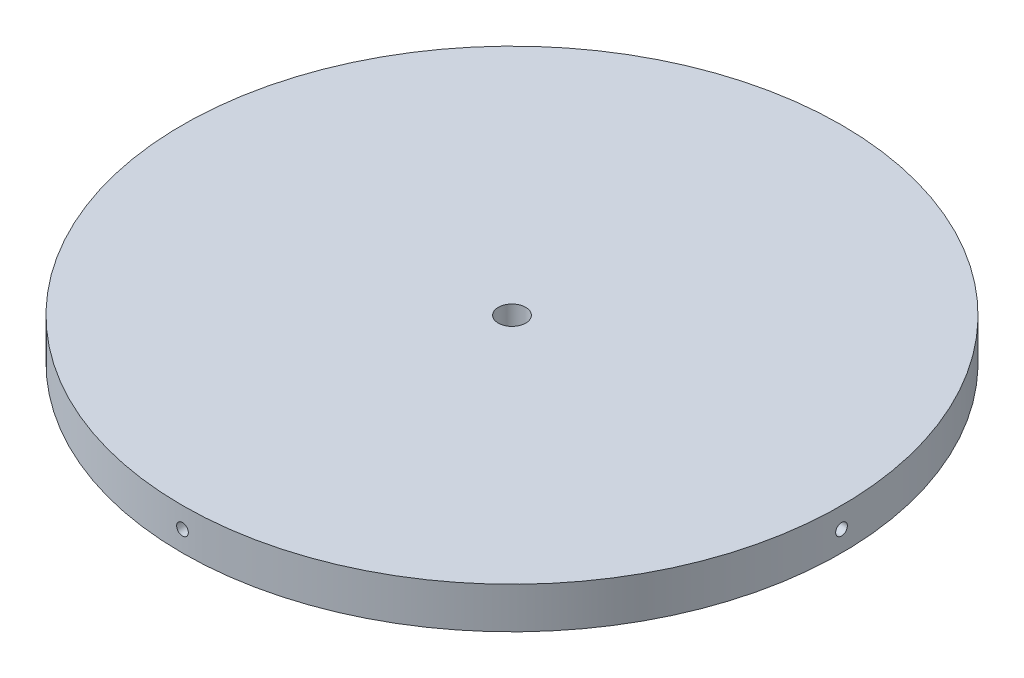
ISO-10303-21;
HEADER;
FILE_DESCRIPTION(('STEP AP214'),'2;1');
FILE_NAME('part.step','',(''),(''),'','','');
FILE_SCHEMA(('AUTOMOTIVE_DESIGN { 1 0 10303 214 1 1 1 1 }'));
ENDSEC;
DATA;
#1=APPLICATION_CONTEXT('core data for automotive mechanical design processes');
#2=APPLICATION_PROTOCOL_DEFINITION('international standard','automotive_design',2000,#1);
#3=PRODUCT_CONTEXT('',#1,'mechanical');
#4=PRODUCT('Part','Part','',(#3));
#5=PRODUCT_RELATED_PRODUCT_CATEGORY('part','',(#4));
#6=PRODUCT_DEFINITION_FORMATION('','',#4);
#7=PRODUCT_DEFINITION_CONTEXT('part definition',#1,'design');
#8=PRODUCT_DEFINITION('design','',#6,#7);
#9=PRODUCT_DEFINITION_SHAPE('','',#8);
#10=(LENGTH_UNIT() NAMED_UNIT(*) SI_UNIT(.MILLI.,.METRE.));
#11=(NAMED_UNIT(*) PLANE_ANGLE_UNIT() SI_UNIT($,.RADIAN.));
#12=(NAMED_UNIT(*) SI_UNIT($,.STERADIAN.) SOLID_ANGLE_UNIT());
#13=UNCERTAINTY_MEASURE_WITH_UNIT(LENGTH_MEASURE(1.E-05),#10,'distance_accuracy_value','');
#14=(GEOMETRIC_REPRESENTATION_CONTEXT(3) GLOBAL_UNCERTAINTY_ASSIGNED_CONTEXT((#13)) GLOBAL_UNIT_ASSIGNED_CONTEXT((#10,
#11,#12)) REPRESENTATION_CONTEXT('',''));
#15=CARTESIAN_POINT('',(0.,0.,0.));
#16=DIRECTION('',(0.,0.,1.));
#17=DIRECTION('',(1.,0.,0.));
#18=AXIS2_PLACEMENT_3D('',#15,#16,#17);
#19=CARTESIAN_POINT('',(0.,9.525,0.));
#20=DIRECTION('',(0.,-1.,0.));
#21=DIRECTION('',(0.,0.,-1.));
#22=AXIS2_PLACEMENT_3D('',#19,#20,#21);
#23=CYLINDRICAL_SURFACE('',#22,76.1746);
#24=CARTESIAN_POINT('',(-76.1625911695335,4.7625,1.35255000000079));
#25=CARTESIAN_POINT('',(-76.1625913318178,4.68653309786871,1.35254663318594));
#26=CARTESIAN_POINT('',(-76.1627060477417,4.61051126497765,1.34612842213873));
#27=CARTESIAN_POINT('',(-76.1631526381052,4.46056172084743,1.3206142161901));
#28=CARTESIAN_POINT('',(-76.1634847732258,4.3866366347137,1.30150300224006));
#29=CARTESIAN_POINT('',(-76.1643285653673,4.24307464772097,1.25114740979543));
#30=CARTESIAN_POINT('',(-76.1648401359019,4.17343569996043,1.21990887577359));
#31=CARTESIAN_POINT('',(-76.1659850439857,4.04041009425597,1.14619354351088));
#32=CARTESIAN_POINT('',(-76.1666183514398,3.9770218968928,1.10371952185477));
#33=CARTESIAN_POINT('',(-76.1679355660639,3.85826137607147,1.00872536322316));
#34=CARTESIAN_POINT('',(-76.1686194834858,3.80289068345009,0.956203187386675));
#35=CARTESIAN_POINT('',(-76.1699607411956,3.70175037900739,0.84260635603765));
#36=CARTESIAN_POINT('',(-76.1706180804338,3.65598114608205,0.781531363169549));
#37=CARTESIAN_POINT('',(-76.1718320812533,3.57534349835677,0.652560465586628));
#38=CARTESIAN_POINT('',(-76.1723887380619,3.54047560024732,0.584664237767256));
#39=CARTESIAN_POINT('',(-76.1733385746897,3.48263395049007,0.443980593985543));
#40=CARTESIAN_POINT('',(-76.1737317549518,3.45966016660453,0.371193191280818));
#41=CARTESIAN_POINT('',(-76.1743102772881,3.42626112549406,0.222801407657146));
#42=CARTESIAN_POINT('',(-76.1744956411789,3.41583455104581,0.147197323296592));
#43=CARTESIAN_POINT('',(-76.1746377065854,3.40782186013706,-0.00468828794464257));
#44=CARTESIAN_POINT('',(-76.1745944086883,3.41023571069592,-0.0809698130848129));
#45=CARTESIAN_POINT('',(-76.1742840512528,3.42783418744218,-0.232035998008856));
#46=CARTESIAN_POINT('',(-76.1740170168757,3.44301737759825,-0.30682082514221));
#47=CARTESIAN_POINT('',(-76.1732893175446,3.4857213252721,-0.452779916711149));
#48=CARTESIAN_POINT('',(-76.1728286523085,3.5132421007662,-0.523954175885833));
#49=CARTESIAN_POINT('',(-76.1717655783832,3.5798416417419,-0.660676284030646));
#50=CARTESIAN_POINT('',(-76.1711631616189,3.61892106571735,-0.726223812172487));
#51=CARTESIAN_POINT('',(-76.1698844932242,3.70752806105337,-0.849828238940553));
#52=CARTESIAN_POINT('',(-76.169208241554,3.75705563803346,-0.907885133537938));
#53=CARTESIAN_POINT('',(-76.1678580243648,3.86516117015754,-1.01486865597108));
#54=CARTESIAN_POINT('',(-76.1671840591745,3.92374037464282,-1.06379402137592));
#55=CARTESIAN_POINT('',(-76.165914493049,4.04828187743854,-1.1511159371692));
#56=CARTESIAN_POINT('',(-76.1653188921247,4.11424417678791,-1.18951248607604));
#57=CARTESIAN_POINT('',(-76.1642732138611,4.25168009404666,-1.25468665966714));
#58=CARTESIAN_POINT('',(-76.1638231370003,4.32315373007827,-1.28146424614435));
#59=CARTESIAN_POINT('',(-76.1631192730441,4.46958309676921,-1.32263956423576));
#60=CARTESIAN_POINT('',(-76.1628654857557,4.54453882400502,-1.33703730802132));
#61=CARTESIAN_POINT('',(-76.1625828484964,4.69579364816456,-1.35304269240563));
#62=CARTESIAN_POINT('',(-76.1625539678065,4.77209256020158,-1.35465207971175));
#63=CARTESIAN_POINT('',(-76.1627243198163,4.92387750401343,-1.34503961511816));
#64=CARTESIAN_POINT('',(-76.1629235524302,4.99936353609414,-1.33381776804693));
#65=CARTESIAN_POINT('',(-76.163527642029,5.14737504847621,-1.29886283211518));
#66=CARTESIAN_POINT('',(-76.1639324860076,5.21990071572595,-1.27513053461639));
#67=CARTESIAN_POINT('',(-76.1649021458778,5.3599384524946,-1.21582918789614));
#68=CARTESIAN_POINT('',(-76.1654669618686,5.42745051889775,-1.18026013131863));
#69=CARTESIAN_POINT('',(-76.1666929646331,5.55555265144326,-1.09829045300828));
#70=CARTESIAN_POINT('',(-76.1673541618726,5.61614196457616,-1.05188865463172));
#71=CARTESIAN_POINT('',(-76.1686983478926,5.72867110910763,-0.949572408402749));
#72=CARTESIAN_POINT('',(-76.1693813366983,5.78061093050641,-0.893657949552762));
#73=CARTESIAN_POINT('',(-76.1706921961768,5.87437249039245,-0.773896138553624));
#74=CARTESIAN_POINT('',(-76.1713200607014,5.9161931011722,-0.710047903445597));
#75=CARTESIAN_POINT('',(-76.172449800465,5.98852135229293,-0.576235552859802));
#76=CARTESIAN_POINT('',(-76.1729516758898,6.01902900933406,-0.506271446410454));
#77=CARTESIAN_POINT('',(-76.1737728288505,6.06786339526051,-0.362217653866183));
#78=CARTESIAN_POINT('',(-76.1740921174107,6.08619085957265,-0.288128217147021));
#79=CARTESIAN_POINT('',(-76.1745121451594,6.11014703050433,-0.137923290346605));
#80=CARTESIAN_POINT('',(-76.1746128841591,6.11577572614824,-0.0618077985142768));
#81=CARTESIAN_POINT('',(-76.1745844558271,6.11417445973102,0.0902771157054055));
#82=CARTESIAN_POINT('',(-76.1744553205151,6.10694628852903,0.166246556960894));
#83=CARTESIAN_POINT('',(-76.1739817621638,6.07984012377235,0.315893573384177));
#84=CARTESIAN_POINT('',(-76.1736373386937,6.05996210489637,0.389571143964009));
#85=CARTESIAN_POINT('',(-76.172772016909,6.00812045662003,0.532544410246637));
#86=CARTESIAN_POINT('',(-76.1722511153782,5.97615660696814,0.601840026066066));
#87=CARTESIAN_POINT('',(-76.171091570252,5.90105214198545,0.734079137418544));
#88=CARTESIAN_POINT('',(-76.1704529311519,5.85791195335362,0.797022875331085));
#89=CARTESIAN_POINT('',(-76.1691298427897,5.76167753104772,0.914777610084021));
#90=CARTESIAN_POINT('',(-76.1684453920218,5.70858297009328,0.969588339420757));
#91=CARTESIAN_POINT('',(-76.1671076722016,5.59393010957159,1.06953236851041));
#92=CARTESIAN_POINT('',(-76.1664544109313,5.53236971241236,1.11466326276146));
#93=CARTESIAN_POINT('',(-76.1652525839246,5.40251728126712,1.193969380067));
#94=CARTESIAN_POINT('',(-76.1647040746045,5.33422164974635,1.22813870625481));
#95=CARTESIAN_POINT('',(-76.1637747249306,5.19291543897584,1.28448687045357));
#96=CARTESIAN_POINT('',(-76.1633936840465,5.11991061945161,1.30668005624902));
#97=CARTESIAN_POINT('',(-76.162944445983,4.99911830304652,1.33254273142713));
#98=CARTESIAN_POINT('',(-76.1628125397191,4.95211539888689,1.34003606670425));
#99=CARTESIAN_POINT('',(-76.1626358507074,4.85758217076169,1.35004075447477));
#100=CARTESIAN_POINT('',(-76.1625910679508,4.81005184684975,1.35255210747469));
#101=CARTESIAN_POINT('',(-76.1625911695335,4.7625,1.35255000000079));
#102=B_SPLINE_CURVE_WITH_KNOTS('',3,(#24,#25,#26,#27,#28,#29,#30,#31,#32,#33,#34,#35,#36,#37,
#38,#39,#40,#41,#42,#43,#44,#45,#46,#47,#48,#49,#50,#51,#52,#53,#54,#55,#56,#57,#58,#59,#60,#61,
#62,#63,#64,#65,#66,#67,#68,#69,#70,#71,#72,#73,#74,#75,#76,#77,#78,#79,#80,#81,#82,#83,#84,#85,
#86,#87,#88,#89,#90,#91,#92,#93,#94,#95,#96,#97,#98,#99,#100,#101),.UNSPECIFIED.,.T.,.F.,(4,2,2,
2,2,2,2,2,2,2,2,2,2,2,2,2,2,2,2,2,2,2,2,2,2,2,2,2,2,2,2,2,2,2,2,2,2,2,4),(0.,0.227727140072635,
0.455727821586148,0.683618759737946,0.911453432568021,1.1393343842314,1.36722432691727,
1.59512506926415,1.823025193907,2.05090139119322,2.27877700317945,2.50662699185412,
2.73447731251577,2.96234061626461,3.19020404256931,3.41809894762149,3.64599388474286,
3.8738895712536,4.10178503370631,4.3296493683493,4.55751361724546,4.78536345407753,
5.01321343250887,5.24108817134626,5.46896317363123,5.69686355913317,5.9247636082078,
6.15264989567459,6.38053638010493,6.60839112424907,6.83624632449302,7.06410567735778,
7.29195633211224,7.51981447946663,7.7477291856114,7.97576629555885,8.20352960007281,
8.34607651044311,8.48862340632087),.UNSPECIFIED.);
#103=CARTESIAN_POINT('',(-76.1625911695335,4.7625,1.35255000000079));
#104=VERTEX_POINT('',#103);
#105=EDGE_CURVE('E11',#104,#104,#102,.T.);
#106=ORIENTED_EDGE('',*,*,#105,.T.);
#107=EDGE_LOOP('',(#106));
#108=FACE_BOUND('',#107,.T.);
#109=CARTESIAN_POINT('',(0.,6.11504999999999,-76.1746));
#110=CARTESIAN_POINT('',(-0.0759669031959398,6.11504663318611,-76.1745998378203));
#111=CARTESIAN_POINT('',(-0.151988737147994,6.10862842196507,-76.1744851405251));
#112=CARTESIAN_POINT('',(-0.301938283482509,6.0831142152633,-76.1740386164844));
#113=CARTESIAN_POINT('',(-0.375863370760367,6.06400300073754,-76.1737065290927));
#114=CARTESIAN_POINT('',(-0.519425360171584,6.01364740660829,-76.1728628406467));
#115=CARTESIAN_POINT('',(-0.589064309196794,5.98240887145006,-76.1723513260741));
#116=CARTESIAN_POINT('',(-0.722089917016071,5.90869353651212,-76.1712065135406));
#117=CARTESIAN_POINT('',(-0.785478115230995,5.86621951332,-76.1705732456787));
#118=CARTESIAN_POINT('',(-0.904238635073783,5.77122535314371,-76.1692560766181));
#119=CARTESIAN_POINT('',(-0.959609326138674,5.71870317764102,-76.1685721651624));
#120=CARTESIAN_POINT('',(-1.06074962758195,5.60510634761105,-76.1672308830571));
#121=CARTESIAN_POINT('',(-1.1065188590596,5.544031355724,-76.1665735134558));
#122=CARTESIAN_POINT('',(-1.18715650528408,5.41506045898393,-76.1653594289303));
#123=CARTESIAN_POINT('',(-1.22202440307092,5.34716423085783,-76.1648027187802));
#124=CARTESIAN_POINT('',(-1.27986605214682,5.20648058640919,-76.1638527758335));
#125=CARTESIAN_POINT('',(-1.30283983567756,5.13369318334589,-76.1634595425938));
#126=CARTESIAN_POINT('',(-1.33623887602735,4.98530139869178,-76.1628809379442));
#127=CARTESIAN_POINT('',(-1.34666545004531,4.90969731365389,-76.1626955447155));
#128=CARTESIAN_POINT('',(-1.35467813985884,4.75781170109146,-76.1625534570781));
#129=CARTESIAN_POINT('',(-1.35226428863958,4.68153017530768,-76.1625967620819));
#130=CARTESIAN_POINT('',(-1.33466581086186,4.53046399333399,-76.1629071671051));
#131=CARTESIAN_POINT('',(-1.31948262099914,4.45567916971715,-76.1631742419478));
#132=CARTESIAN_POINT('',(-1.27677867513642,4.30972008503016,-76.1639020377809));
#133=CARTESIAN_POINT('',(-1.24925790115358,4.23854582922281,-76.1643627590535));
#134=CARTESIAN_POINT('',(-1.18265836327778,4.10182372510504,-76.1654259361396));
#135=CARTESIAN_POINT('',(-1.14357894053353,4.03627619779705,-76.166028400032));
#136=CARTESIAN_POINT('',(-1.05497194780953,3.91267177217164,-76.1673071330586));
#137=CARTESIAN_POINT('',(-1.00544437221108,3.85461487788248,-76.1679834022326));
#138=CARTESIAN_POINT('',(-0.897338841049925,3.74763135383609,-76.1693336172077));
#139=CARTESIAN_POINT('',(-0.838759635868295,3.69870598679023,-76.1700075626749));
#140=CARTESIAN_POINT('',(-0.714218131100806,3.61138406802023,-76.1712770606937));
#141=CARTESIAN_POINT('',(-0.648255830478291,3.57298751777443,-76.1718726132344));
#142=CARTESIAN_POINT('',(-0.510819912911578,3.50781334322623,-76.1729181873081));
#143=CARTESIAN_POINT('',(-0.439346278044282,3.48103575671107,-76.1733682083677));
#144=CARTESIAN_POINT('',(-0.292916913878398,3.43986043818532,-76.1740719777359));
#145=CARTESIAN_POINT('',(-0.217961188001414,3.42546269401023,-76.1743257262373));
#146=CARTESIAN_POINT('',(-0.0667063644147724,3.40945730816293,-76.1746083200011));
#147=CARTESIAN_POINT('',(0.00959254844751346,3.40784792015508,-76.1746371959715));
#148=CARTESIAN_POINT('',(0.161377494079737,3.41746038363994,-76.1744668705921));
#149=CARTESIAN_POINT('',(0.236863527155562,3.42868223030407,-76.1742676693282));
#150=CARTESIAN_POINT('',(0.384875044189094,3.46363716640883,-76.173663664801));
#151=CARTESIAN_POINT('',(0.457400714997972,3.48736946489914,-76.1732588745357));
#152=CARTESIAN_POINT('',(0.597438458444466,3.54667081479803,-76.1722893208728));
#153=CARTESIAN_POINT('',(0.664950527968757,3.58223987355686,-76.1717245573758));
#154=CARTESIAN_POINT('',(0.793052662549558,3.66420955502574,-76.1704986354668));
#155=CARTESIAN_POINT('',(0.853641974951883,3.71061135382428,-76.1698374665911));
#156=CARTESIAN_POINT('',(0.966171117811906,3.812927600488,-76.1684933006567));
#157=CARTESIAN_POINT('',(1.0181109382667,3.86884205935417,-76.1678103035729));
#158=CARTESIAN_POINT('',(1.11187249624285,3.98860386992294,-76.1664993945718));
#159=CARTESIAN_POINT('',(1.15369310605572,4.05245210458512,-76.1658714887992));
#160=CARTESIAN_POINT('',(1.22602135547702,4.18626445403353,-76.1647416515947));
#161=CARTESIAN_POINT('',(1.25652901178564,4.25622855979132,-76.1642397199769));
#162=CARTESIAN_POINT('',(1.30536339719808,4.40028235287769,-76.1634184643603));
#163=CARTESIAN_POINT('',(1.32369086141227,4.47437179093779,-76.1630991293414));
#164=CARTESIAN_POINT('',(1.34764703169322,4.6245767205557,-76.1626790387343));
#165=CARTESIAN_POINT('',(1.35327572679142,4.70069221386346,-76.1625782833351));
#166=CARTESIAN_POINT('',(1.35167445883825,4.85277712704119,-76.1626067161695));
#167=CARTESIAN_POINT('',(1.34444628729294,4.92874656578615,-76.1627358723668));
#168=CARTESIAN_POINT('',(1.31734012273543,5.07839357710609,-76.1632095005568));
#169=CARTESIAN_POINT('',(1.29746210439744,5.15207114509229,-76.1635539729806));
#170=CARTESIAN_POINT('',(1.24562045811338,5.29504440637428,-76.1644193993455));
#171=CARTESIAN_POINT('',(1.21365660991066,5.36434001978482,-76.164940356503));
#172=CARTESIAN_POINT('',(1.1385521485672,5.49657912692842,-76.1660999951169));
#173=CARTESIAN_POINT('',(1.09541196212285,5.55952286303949,-76.1667386720787));
#174=CARTESIAN_POINT('',(0.999177542161064,5.67727759804536,-76.168061801904));
#175=CARTESIAN_POINT('',(0.946082980867527,5.73208832903134,-76.1687462562743));
#176=CARTESIAN_POINT('',(0.831430118997713,5.83203236128946,-76.1700839473755));
#177=CARTESIAN_POINT('',(0.769869720832981,5.87716325706396,-76.1707371763155));
#178=CARTESIAN_POINT('',(0.640017288932585,5.95646937593903,-76.1719389169514));
#179=CARTESIAN_POINT('',(0.571721657840508,5.99063870246546,-76.1724873722223));
#180=CARTESIAN_POINT('',(0.430415447990483,6.04698686741764,-76.1734166157479));
#181=CARTESIAN_POINT('',(0.357410628955742,6.06918005362238,-76.1737976045306));
#182=CARTESIAN_POINT('',(0.236618311449319,6.09504272999781,-76.174246777958));
#183=CARTESIAN_POINT('',(0.189615405614296,6.10253606581219,-76.1743786641761));
#184=CARTESIAN_POINT('',(0.0950821741295524,6.11254075429683,-76.1745553259513));
#185=CARTESIAN_POINT('',(0.0475518485334259,6.11505210747334,-76.1746001015172));
#186=CARTESIAN_POINT('',(0.,6.11504999999999,-76.1746));
#187=B_SPLINE_CURVE_WITH_KNOTS('',3,(#109,#110,#111,#112,#113,#114,#115,#116,#117,#118,#119,
#120,#121,#122,#123,#124,#125,#126,#127,#128,#129,#130,#131,#132,#133,#134,#135,#136,#137,#138,
#139,#140,#141,#142,#143,#144,#145,#146,#147,#148,#149,#150,#151,#152,#153,#154,#155,#156,#157,
#158,#159,#160,#161,#162,#163,#164,#165,#166,#167,#168,#169,#170,#171,#172,#173,#174,#175,#176,
#177,#178,#179,#180,#181,#182,#183,#184,#185,#186),.UNSPECIFIED.,.T.,.F.,(4,2,2,2,2,2,2,2,2,2,2,
2,2,2,2,2,2,2,2,2,2,2,2,2,2,2,2,2,2,2,2,2,2,2,2,2,2,2,4),(0.,0.227727143269717,
0.455727827910921,0.683618769709577,0.911453446130337,1.13933439361215,1.36722433222943,
1.59512507614102,1.82302520227312,2.05090140149201,2.27877701533088,2.50662699400251,
2.73447730478141,2.96234060569549,3.19020402914776,3.41809893834134,3.6459938795335,
3.87388956188116,4.10178502029675,4.32964935752718,4.5575136090091,4.78536345592028,
5.01321344431952,5.24108818144064,5.4689631820908,5.6968635659797,5.92476361344074,
6.15264990521509,6.38053639382594,6.60839113068469,6.8362463237248,7.06410566948288,
7.29195631718295,7.51981446883156,7.74772917917171,7.97576628724141,8.20352958998387,
8.34607650539727,8.4886234063257),.UNSPECIFIED.);
#188=CARTESIAN_POINT('',(0.,6.11504999999999,-76.1746));
#189=VERTEX_POINT('',#188);
#190=EDGE_CURVE('E47',#189,#189,#187,.T.);
#191=ORIENTED_EDGE('',*,*,#190,.T.);
#192=EDGE_LOOP('',(#191));
#193=FACE_BOUND('',#192,.T.);
#194=CARTESIAN_POINT('',(76.1625911695335,4.7625,-1.35255000000025));
#195=CARTESIAN_POINT('',(76.1625913318179,4.68653309786871,-1.35254663318541));
#196=CARTESIAN_POINT('',(76.1627060477417,4.61051126497765,-1.3461284221382));
#197=CARTESIAN_POINT('',(76.1631526381052,4.46056172084743,-1.32061421618956));
#198=CARTESIAN_POINT('',(76.1634847732259,4.3866366347137,-1.30150300223953));
#199=CARTESIAN_POINT('',(76.1643285653673,4.24307464772097,-1.2511474097949));
#200=CARTESIAN_POINT('',(76.164840135902,4.17343569996043,-1.21990887577306));
#201=CARTESIAN_POINT('',(76.1659850439857,4.04041009425597,-1.14619354351035));
#202=CARTESIAN_POINT('',(76.1666183514398,3.9770218968928,-1.10371952185424));
#203=CARTESIAN_POINT('',(76.1679355660639,3.85826137607147,-1.00872536322262));
#204=CARTESIAN_POINT('',(76.1686194834858,3.80289068345009,-0.956203187386144));
#205=CARTESIAN_POINT('',(76.1699607411956,3.70175037900739,-0.842606356037118));
#206=CARTESIAN_POINT('',(76.1706180804338,3.65598114608205,-0.781531363169017));
#207=CARTESIAN_POINT('',(76.1718320812533,3.57534349835677,-0.652560465586096));
#208=CARTESIAN_POINT('',(76.1723887380619,3.54047560024732,-0.584664237766724));
#209=CARTESIAN_POINT('',(76.1733385746897,3.48263395049007,-0.443980593985011));
#210=CARTESIAN_POINT('',(76.1737317549518,3.45966016660453,-0.371193191280286));
#211=CARTESIAN_POINT('',(76.1743102772881,3.42626112549406,-0.222801407656614));
#212=CARTESIAN_POINT('',(76.1744956411789,3.41583455104581,-0.14719732329606));
#213=CARTESIAN_POINT('',(76.1746377065854,3.40782186013706,0.00468828794517483));
#214=CARTESIAN_POINT('',(76.1745944086883,3.41023571069592,0.0809698130853454));
#215=CARTESIAN_POINT('',(76.1742840512528,3.42783418744218,0.232035998009389));
#216=CARTESIAN_POINT('',(76.1740170168757,3.44301737759825,0.306820825142744));
#217=CARTESIAN_POINT('',(76.1732893175446,3.4857213252721,0.452779916711682));
#218=CARTESIAN_POINT('',(76.1728286523085,3.5132421007662,0.523954175886366));
#219=CARTESIAN_POINT('',(76.1717655783832,3.5798416417419,0.660676284031178));
#220=CARTESIAN_POINT('',(76.1711631616189,3.61892106571735,0.726223812173019));
#221=CARTESIAN_POINT('',(76.1698844932242,3.70752806105337,0.849828238941086));
#222=CARTESIAN_POINT('',(76.169208241554,3.75705563803346,0.90788513353847));
#223=CARTESIAN_POINT('',(76.1678580243648,3.86516117015754,1.01486865597161));
#224=CARTESIAN_POINT('',(76.1671840591745,3.92374037464282,1.06379402137645));
#225=CARTESIAN_POINT('',(76.1659144930489,4.04828187743854,1.15111593716974));
#226=CARTESIAN_POINT('',(76.1653188921247,4.11424417678791,1.18951248607658));
#227=CARTESIAN_POINT('',(76.1642732138611,4.25168009404666,1.25468665966767));
#228=CARTESIAN_POINT('',(76.1638231370003,4.32315373007827,1.28146424614488));
#229=CARTESIAN_POINT('',(76.1631192730441,4.46958309676921,1.32263956423629));
#230=CARTESIAN_POINT('',(76.1628654857557,4.54453882400502,1.33703730802185));
#231=CARTESIAN_POINT('',(76.1625828484964,4.69579364816457,1.35304269240616));
#232=CARTESIAN_POINT('',(76.1625539678065,4.77209256020158,1.35465207971228));
#233=CARTESIAN_POINT('',(76.1627243198163,4.92387750401343,1.34503961511869));
#234=CARTESIAN_POINT('',(76.1629235524302,4.99936353609414,1.33381776804746));
#235=CARTESIAN_POINT('',(76.163527642029,5.14737504847621,1.29886283211571));
#236=CARTESIAN_POINT('',(76.1639324860076,5.21990071572595,1.27513053461692));
#237=CARTESIAN_POINT('',(76.1649021458777,5.3599384524946,1.21582918789667));
#238=CARTESIAN_POINT('',(76.1654669618686,5.42745051889775,1.18026013131916));
#239=CARTESIAN_POINT('',(76.1666929646331,5.55555265144326,1.09829045300881));
#240=CARTESIAN_POINT('',(76.1673541618726,5.61614196457616,1.05188865463225));
#241=CARTESIAN_POINT('',(76.1686983478926,5.72867110910763,0.949572408403281));
#242=CARTESIAN_POINT('',(76.1693813366983,5.78061093050641,0.893657949553294));
#243=CARTESIAN_POINT('',(76.1706921961767,5.87437249039245,0.773896138554155));
#244=CARTESIAN_POINT('',(76.1713200607014,5.9161931011722,0.710047903446129));
#245=CARTESIAN_POINT('',(76.172449800465,5.98852135229293,0.576235552860333));
#246=CARTESIAN_POINT('',(76.1729516758898,6.01902900933406,0.506271446410986));
#247=CARTESIAN_POINT('',(76.1737728288505,6.06786339526051,0.362217653866714));
#248=CARTESIAN_POINT('',(76.1740921174107,6.08619085957265,0.288128217147552));
#249=CARTESIAN_POINT('',(76.1745121451594,6.11014703050433,0.137923290347137));
#250=CARTESIAN_POINT('',(76.1746128841591,6.11577572614824,0.061807798514808));
#251=CARTESIAN_POINT('',(76.1745844558271,6.11417445973102,-0.0902771157048748));
#252=CARTESIAN_POINT('',(76.1744553205151,6.10694628852903,-0.166246556960363));
#253=CARTESIAN_POINT('',(76.1739817621638,6.07984012377235,-0.315893573383646));
#254=CARTESIAN_POINT('',(76.1736373386937,6.05996210489637,-0.389571143963478));
#255=CARTESIAN_POINT('',(76.172772016909,6.00812045662003,-0.532544410246106));
#256=CARTESIAN_POINT('',(76.1722511153782,5.97615660696814,-0.601840026065535));
#257=CARTESIAN_POINT('',(76.171091570252,5.90105214198545,-0.734079137418013));
#258=CARTESIAN_POINT('',(76.1704529311519,5.85791195335362,-0.797022875330554));
#259=CARTESIAN_POINT('',(76.1691298427897,5.76167753104772,-0.91477761008349));
#260=CARTESIAN_POINT('',(76.1684453920219,5.70858297009328,-0.969588339420225));
#261=CARTESIAN_POINT('',(76.1671076722016,5.59393010957159,-1.06953236850988));
#262=CARTESIAN_POINT('',(76.1664544109313,5.53236971241236,-1.11466326276093));
#263=CARTESIAN_POINT('',(76.1652525839246,5.40251728126712,-1.19396938006647));
#264=CARTESIAN_POINT('',(76.1647040746045,5.33422164974635,-1.22813870625428));
#265=CARTESIAN_POINT('',(76.1637747249306,5.19291543897584,-1.28448687045303));
#266=CARTESIAN_POINT('',(76.1633936840466,5.1199106194516,-1.30668005624849));
#267=CARTESIAN_POINT('',(76.162944445983,4.99911830304651,-1.3325427314266));
#268=CARTESIAN_POINT('',(76.1628125397191,4.95211539888689,-1.34003606670372));
#269=CARTESIAN_POINT('',(76.1626358507074,4.85758217076169,-1.35004075447424));
#270=CARTESIAN_POINT('',(76.1625910679508,4.81005184684975,-1.35255210747416));
#271=CARTESIAN_POINT('',(76.1625911695335,4.7625,-1.35255000000025));
#272=B_SPLINE_CURVE_WITH_KNOTS('',3,(#194,#195,#196,#197,#198,#199,#200,#201,#202,#203,#204,
#205,#206,#207,#208,#209,#210,#211,#212,#213,#214,#215,#216,#217,#218,#219,#220,#221,#222,#223,
#224,#225,#226,#227,#228,#229,#230,#231,#232,#233,#234,#235,#236,#237,#238,#239,#240,#241,#242,
#243,#244,#245,#246,#247,#248,#249,#250,#251,#252,#253,#254,#255,#256,#257,#258,#259,#260,#261,
#262,#263,#264,#265,#266,#267,#268,#269,#270,#271),.UNSPECIFIED.,.T.,.F.,(4,2,2,2,2,2,2,2,2,2,2,
2,2,2,2,2,2,2,2,2,2,2,2,2,2,2,2,2,2,2,2,2,2,2,2,2,2,2,4),(0.,0.227727140072635,
0.455727821586148,0.683618759737944,0.91145343256802,1.1393343842314,1.36722432691727,
1.59512506926415,1.823025193907,2.05090139119322,2.27877700317946,2.50662699185412,
2.73447731251577,2.96234061626461,3.19020404256931,3.41809894762149,3.64599388474286,
3.8738895712536,4.10178503370631,4.3296493683493,4.55751361724546,4.78536345407753,
5.01321343250888,5.24108817134626,5.46896317363123,5.69686355913317,5.9247636082078,
6.15264989567459,6.38053638010493,6.60839112424907,6.83624632449302,7.06410567735778,
7.29195633211224,7.51981447946663,7.7477291856114,7.97576629555885,8.20352960007281,
8.34607651044311,8.48862340632087),.UNSPECIFIED.);
#273=CARTESIAN_POINT('',(76.1625911695335,4.7625,-1.35255000000025));
#274=VERTEX_POINT('',#273);
#275=EDGE_CURVE('E99',#274,#274,#272,.T.);
#276=ORIENTED_EDGE('',*,*,#275,.T.);
#277=EDGE_LOOP('',(#276));
#278=FACE_BOUND('',#277,.T.);
#279=CARTESIAN_POINT('',(1.35254999999999,4.7625,76.1625911695335));
#280=CARTESIAN_POINT('',(1.35254663318514,4.68653309786871,76.1625913318179));
#281=CARTESIAN_POINT('',(1.34612842213793,4.61051126497765,76.1627060477417));
#282=CARTESIAN_POINT('',(1.3206142161893,4.46056172084743,76.1631526381052));
#283=CARTESIAN_POINT('',(1.30150300223926,4.3866366347137,76.1634847732259));
#284=CARTESIAN_POINT('',(1.25114740979463,4.24307464772097,76.1643285653673));
#285=CARTESIAN_POINT('',(1.2199088757728,4.17343569996043,76.164840135902));
#286=CARTESIAN_POINT('',(1.14619354351008,4.04041009425597,76.1659850439857));
#287=CARTESIAN_POINT('',(1.10371952185397,3.9770218968928,76.1666183514398));
#288=CARTESIAN_POINT('',(1.00872536322236,3.85826137607147,76.1679355660639));
#289=CARTESIAN_POINT('',(0.956203187385877,3.80289068345009,76.1686194834858));
#290=CARTESIAN_POINT('',(0.842606356036852,3.70175037900739,76.1699607411956));
#291=CARTESIAN_POINT('',(0.781531363168751,3.65598114608205,76.1706180804338));
#292=CARTESIAN_POINT('',(0.65256046558583,3.57534349835677,76.1718320812533));
#293=CARTESIAN_POINT('',(0.584664237766458,3.54047560024732,76.1723887380619));
#294=CARTESIAN_POINT('',(0.443980593984745,3.48263395049007,76.1733385746897));
#295=CARTESIAN_POINT('',(0.371193191280021,3.45966016660453,76.1737317549518));
#296=CARTESIAN_POINT('',(0.222801407656348,3.42626112549406,76.1743102772881));
#297=CARTESIAN_POINT('',(0.147197323295794,3.41583455104581,76.1744956411789));
#298=CARTESIAN_POINT('',(-0.00468828794544046,3.40782186013706,76.1746377065854));
#299=CARTESIAN_POINT('',(-0.080969813085611,3.41023571069592,76.1745944086883));
#300=CARTESIAN_POINT('',(-0.232035998009655,3.42783418744218,76.1742840512528));
#301=CARTESIAN_POINT('',(-0.306820825143009,3.44301737759825,76.1740170168757));
#302=CARTESIAN_POINT('',(-0.452779916711947,3.4857213252721,76.1732893175446));
#303=CARTESIAN_POINT('',(-0.523954175886632,3.5132421007662,76.1728286523085));
#304=CARTESIAN_POINT('',(-0.660676284031444,3.5798416417419,76.1717655783832));
#305=CARTESIAN_POINT('',(-0.726223812173285,3.61892106571735,76.1711631616189));
#306=CARTESIAN_POINT('',(-0.849828238941351,3.70752806105337,76.1698844932242));
#307=CARTESIAN_POINT('',(-0.907885133538735,3.75705563803346,76.169208241554));
#308=CARTESIAN_POINT('',(-1.01486865597188,3.86516117015754,76.1678580243648));
#309=CARTESIAN_POINT('',(-1.06379402137672,3.92374037464282,76.1671840591745));
#310=CARTESIAN_POINT('',(-1.15111593717,4.04828187743854,76.1659144930489));
#311=CARTESIAN_POINT('',(-1.18951248607684,4.11424417678791,76.1653188921247));
#312=CARTESIAN_POINT('',(-1.25468665966794,4.25168009404666,76.1642732138611));
#313=CARTESIAN_POINT('',(-1.28146424614514,4.32315373007827,76.1638231370003));
#314=CARTESIAN_POINT('',(-1.32263956423656,4.46958309676921,76.1631192730441));
#315=CARTESIAN_POINT('',(-1.33703730802212,4.54453882400502,76.1628654857557));
#316=CARTESIAN_POINT('',(-1.35304269240643,4.69579364816456,76.1625828484964));
#317=CARTESIAN_POINT('',(-1.35465207971255,4.77209256020158,76.1625539678065));
#318=CARTESIAN_POINT('',(-1.34503961511896,4.92387750401343,76.1627243198163));
#319=CARTESIAN_POINT('',(-1.33381776804773,4.99936353609414,76.1629235524302));
#320=CARTESIAN_POINT('',(-1.29886283211598,5.14737504847621,76.1635276420289));
#321=CARTESIAN_POINT('',(-1.27513053461719,5.21990071572595,76.1639324860076));
#322=CARTESIAN_POINT('',(-1.21582918789694,5.3599384524946,76.1649021458777));
#323=CARTESIAN_POINT('',(-1.18026013131943,5.42745051889775,76.1654669618686));
#324=CARTESIAN_POINT('',(-1.09829045300907,5.55555265144326,76.1666929646331));
#325=CARTESIAN_POINT('',(-1.05188865463252,5.61614196457616,76.1673541618726));
#326=CARTESIAN_POINT('',(-0.949572408403547,5.72867110910763,76.1686983478926));
#327=CARTESIAN_POINT('',(-0.89365794955356,5.78061093050641,76.1693813366983));
#328=CARTESIAN_POINT('',(-0.773896138554421,5.87437249039245,76.1706921961767));
#329=CARTESIAN_POINT('',(-0.710047903446395,5.9161931011722,76.1713200607014));
#330=CARTESIAN_POINT('',(-0.576235552860599,5.98852135229293,76.1724498004649));
#331=CARTESIAN_POINT('',(-0.506271446411252,6.01902900933406,76.1729516758898));
#332=CARTESIAN_POINT('',(-0.362217653866981,6.06786339526051,76.1737728288505));
#333=CARTESIAN_POINT('',(-0.288128217147819,6.08619085957265,76.1740921174107));
#334=CARTESIAN_POINT('',(-0.137923290347403,6.11014703050433,76.1745121451594));
#335=CARTESIAN_POINT('',(-0.0618077985150745,6.11577572614824,76.1746128841591));
#336=CARTESIAN_POINT('',(0.0902771157046079,6.11417445973102,76.1745844558271));
#337=CARTESIAN_POINT('',(0.166246556960096,6.10694628852903,76.1744553205151));
#338=CARTESIAN_POINT('',(0.315893573383379,6.07984012377235,76.1739817621638));
#339=CARTESIAN_POINT('',(0.389571143963211,6.05996210489637,76.1736373386937));
#340=CARTESIAN_POINT('',(0.53254441024584,6.00812045662003,76.172772016909));
#341=CARTESIAN_POINT('',(0.601840026065269,5.97615660696814,76.1722511153782));
#342=CARTESIAN_POINT('',(0.734079137417747,5.90105214198545,76.171091570252));
#343=CARTESIAN_POINT('',(0.797022875330288,5.85791195335362,76.1704529311519));
#344=CARTESIAN_POINT('',(0.914777610083223,5.76167753104772,76.1691298427897));
#345=CARTESIAN_POINT('',(0.969588339419959,5.70858297009328,76.1684453920218));
#346=CARTESIAN_POINT('',(1.06953236850961,5.59393010957159,76.1671076722016));
#347=CARTESIAN_POINT('',(1.11466326276066,5.53236971241236,76.1664544109313));
#348=CARTESIAN_POINT('',(1.1939693800662,5.40251728126712,76.1652525839247));
#349=CARTESIAN_POINT('',(1.22813870625402,5.33422164974635,76.1647040746045));
#350=CARTESIAN_POINT('',(1.28448687045277,5.19291543897584,76.1637747249306));
#351=CARTESIAN_POINT('',(1.30668005624822,5.11991061945161,76.1633936840466));
#352=CARTESIAN_POINT('',(1.33254273142633,4.99911830304652,76.162944445983));
#353=CARTESIAN_POINT('',(1.34003606670345,4.95211539888689,76.1628125397191));
#354=CARTESIAN_POINT('',(1.35004075447398,4.85758217076169,76.1626358507074));
#355=CARTESIAN_POINT('',(1.3525521074739,4.81005184684975,76.1625910679508));
#356=CARTESIAN_POINT('',(1.35254999999999,4.7625,76.1625911695335));
#357=B_SPLINE_CURVE_WITH_KNOTS('',3,(#279,#280,#281,#282,#283,#284,#285,#286,#287,#288,#289,
#290,#291,#292,#293,#294,#295,#296,#297,#298,#299,#300,#301,#302,#303,#304,#305,#306,#307,#308,
#309,#310,#311,#312,#313,#314,#315,#316,#317,#318,#319,#320,#321,#322,#323,#324,#325,#326,#327,
#328,#329,#330,#331,#332,#333,#334,#335,#336,#337,#338,#339,#340,#341,#342,#343,#344,#345,#346,
#347,#348,#349,#350,#351,#352,#353,#354,#355,#356),.UNSPECIFIED.,.T.,.F.,(4,2,2,2,2,2,2,2,2,2,2,
2,2,2,2,2,2,2,2,2,2,2,2,2,2,2,2,2,2,2,2,2,2,2,2,2,2,2,4),(0.,0.227727140072635,
0.455727821586148,0.683618759737946,0.91145343256802,1.1393343842314,1.36722432691727,
1.59512506926415,1.823025193907,2.05090139119322,2.27877700317946,2.50662699185412,
2.73447731251577,2.96234061626461,3.19020404256931,3.41809894762149,3.64599388474286,
3.8738895712536,4.10178503370631,4.3296493683493,4.55751361724546,4.78536345407753,
5.01321343250887,5.24108817134626,5.46896317363123,5.69686355913317,5.9247636082078,
6.15264989567459,6.38053638010493,6.60839112424907,6.83624632449302,7.06410567735778,
7.29195633211224,7.51981447946663,7.7477291856114,7.97576629555885,8.20352960007281,
8.34607651044311,8.48862340632087),.UNSPECIFIED.);
#358=CARTESIAN_POINT('',(1.35254999999999,4.7625,76.1625911695335));
#359=VERTEX_POINT('',#358);
#360=EDGE_CURVE('E90',#359,#359,#357,.T.);
#361=ORIENTED_EDGE('',*,*,#360,.T.);
#362=EDGE_LOOP('',(#361));
#363=FACE_BOUND('',#362,.T.);
#364=CARTESIAN_POINT('',(0.,9.525,0.));
#365=DIRECTION('',(0.,1.,0.));
#366=DIRECTION('',(0.,0.,1.));
#367=AXIS2_PLACEMENT_3D('',#364,#365,#366);
#368=CIRCLE('',#367,76.1746);
#369=CARTESIAN_POINT('',(0.,9.525,76.1746));
#370=VERTEX_POINT('',#369);
#371=EDGE_CURVE('E87',#370,#370,#368,.T.);
#372=ORIENTED_EDGE('',*,*,#371,.F.);
#373=EDGE_LOOP('',(#372));
#374=FACE_BOUND('',#373,.T.);
#375=CARTESIAN_POINT('',(0.,0.,0.));
#376=DIRECTION('',(0.,1.,0.));
#377=DIRECTION('',(0.,0.,1.));
#378=AXIS2_PLACEMENT_3D('',#375,#376,#377);
#379=CIRCLE('',#378,76.1746);
#380=CARTESIAN_POINT('',(0.,0.,76.1746));
#381=VERTEX_POINT('',#380);
#382=EDGE_CURVE('E84',#381,#381,#379,.T.);
#383=ORIENTED_EDGE('',*,*,#382,.T.);
#384=EDGE_LOOP('',(#383));
#385=FACE_BOUND('',#384,.T.);
#386=ADVANCED_FACE('F35',(#108,#193,#278,#363,#374,#385),#23,.T.);
#387=CARTESIAN_POINT('',(0.,9.525,0.));
#388=DIRECTION('',(0.,1.,0.));
#389=DIRECTION('',(0.,0.,1.));
#390=AXIS2_PLACEMENT_3D('',#387,#388,#389);
#391=PLANE('',#390);
#392=CARTESIAN_POINT('',(0.,9.525,0.));
#393=DIRECTION('',(0.,1.,0.));
#394=DIRECTION('',(0.,0.,1.));
#395=AXIS2_PLACEMENT_3D('',#392,#393,#394);
#396=CIRCLE('',#395,3.175);
#397=CARTESIAN_POINT('',(0.,9.525,3.175));
#398=VERTEX_POINT('',#397);
#399=EDGE_CURVE('E80',#398,#398,#396,.T.);
#400=ORIENTED_EDGE('',*,*,#399,.F.);
#401=EDGE_LOOP('',(#400));
#402=FACE_BOUND('',#401,.T.);
#403=ORIENTED_EDGE('',*,*,#371,.T.);
#404=EDGE_LOOP('',(#403));
#405=FACE_BOUND('',#404,.T.);
#406=ADVANCED_FACE('F120',(#402,#405),#391,.T.);
#407=CARTESIAN_POINT('',(0.,0.,0.));
#408=DIRECTION('',(0.,1.,0.));
#409=DIRECTION('',(0.,0.,1.));
#410=AXIS2_PLACEMENT_3D('',#407,#408,#409);
#411=PLANE('',#410);
#412=CARTESIAN_POINT('',(0.,0.,0.));
#413=DIRECTION('',(0.,1.,0.));
#414=DIRECTION('',(0.,0.,1.));
#415=AXIS2_PLACEMENT_3D('',#412,#413,#414);
#416=CIRCLE('',#415,3.175);
#417=CARTESIAN_POINT('',(0.,0.,3.175));
#418=VERTEX_POINT('',#417);
#419=EDGE_CURVE('E81',#418,#418,#416,.T.);
#420=ORIENTED_EDGE('',*,*,#419,.T.);
#421=EDGE_LOOP('',(#420));
#422=FACE_BOUND('',#421,.T.);
#423=ORIENTED_EDGE('',*,*,#382,.F.);
#424=EDGE_LOOP('',(#423));
#425=FACE_BOUND('',#424,.T.);
#426=ADVANCED_FACE('F118',(#422,#425),#411,.F.);
#427=CARTESIAN_POINT('',(0.,0.,0.));
#428=DIRECTION('',(0.,1.,0.));
#429=DIRECTION('',(0.,0.,1.));
#430=AXIS2_PLACEMENT_3D('',#427,#428,#429);
#431=CYLINDRICAL_SURFACE('',#430,3.175);
#432=CARTESIAN_POINT('',(0.,0.,3.175));
#433=CARTESIAN_POINT('',(0.,0.0992187499999999,3.175));
#434=CARTESIAN_POINT('',(0.,0.1984375,3.175));
#435=CARTESIAN_POINT('',(0.,0.396875,3.175));
#436=CARTESIAN_POINT('',(0.,0.49609375,3.175));
#437=CARTESIAN_POINT('',(0.,0.69453125,3.175));
#438=CARTESIAN_POINT('',(0.,0.79375,3.175));
#439=CARTESIAN_POINT('',(0.,0.9921875,3.175));
#440=CARTESIAN_POINT('',(0.,1.09140625,3.175));
#441=CARTESIAN_POINT('',(0.,1.28984375,3.175));
#442=CARTESIAN_POINT('',(0.,1.3890625,3.175));
#443=CARTESIAN_POINT('',(0.,1.5875,3.175));
#444=CARTESIAN_POINT('',(0.,1.68671875,3.175));
#445=CARTESIAN_POINT('',(0.,1.88515625,3.175));
#446=CARTESIAN_POINT('',(0.,1.984375,3.175));
#447=CARTESIAN_POINT('',(0.,2.1828125,3.175));
#448=CARTESIAN_POINT('',(0.,2.28203125,3.175));
#449=CARTESIAN_POINT('',(0.,2.48046875,3.175));
#450=CARTESIAN_POINT('',(0.,2.5796875,3.175));
#451=CARTESIAN_POINT('',(0.,2.778125,3.175));
#452=CARTESIAN_POINT('',(0.,2.87734375,3.175));
#453=CARTESIAN_POINT('',(0.,3.07578125,3.175));
#454=CARTESIAN_POINT('',(0.,3.175,3.175));
#455=CARTESIAN_POINT('',(0.,3.3734375,3.175));
#456=CARTESIAN_POINT('',(0.,3.47265625,3.175));
#457=CARTESIAN_POINT('',(0.,3.67109375,3.175));
#458=CARTESIAN_POINT('',(0.,3.7703125,3.175));
#459=CARTESIAN_POINT('',(0.,3.96875,3.175));
#460=CARTESIAN_POINT('',(0.,4.06796875,3.175));
#461=CARTESIAN_POINT('',(0.,4.26640625,3.175));
#462=CARTESIAN_POINT('',(0.,4.365625,3.175));
#463=CARTESIAN_POINT('',(0.,4.5640625,3.175));
#464=CARTESIAN_POINT('',(0.,4.66328125,3.175));
#465=CARTESIAN_POINT('',(0.,4.86171875,3.175));
#466=CARTESIAN_POINT('',(0.,4.9609375,3.175));
#467=CARTESIAN_POINT('',(0.,5.159375,3.175));
#468=CARTESIAN_POINT('',(0.,5.25859375,3.175));
#469=CARTESIAN_POINT('',(0.,5.45703125,3.175));
#470=CARTESIAN_POINT('',(0.,5.55625,3.175));
#471=CARTESIAN_POINT('',(0.,5.7546875,3.175));
#472=CARTESIAN_POINT('',(0.,5.85390625,3.175));
#473=CARTESIAN_POINT('',(0.,6.05234375,3.175));
#474=CARTESIAN_POINT('',(0.,6.1515625,3.175));
#475=CARTESIAN_POINT('',(0.,6.35,3.175));
#476=CARTESIAN_POINT('',(0.,6.44921875,3.175));
#477=CARTESIAN_POINT('',(0.,6.64765625,3.175));
#478=CARTESIAN_POINT('',(0.,6.746875,3.175));
#479=CARTESIAN_POINT('',(0.,6.9453125,3.175));
#480=CARTESIAN_POINT('',(0.,7.04453125,3.175));
#481=CARTESIAN_POINT('',(0.,7.24296875,3.175));
#482=CARTESIAN_POINT('',(0.,7.3421875,3.175));
#483=CARTESIAN_POINT('',(0.,7.540625,3.175));
#484=CARTESIAN_POINT('',(0.,7.63984375,3.175));
#485=CARTESIAN_POINT('',(0.,7.83828125,3.175));
#486=CARTESIAN_POINT('',(0.,7.9375,3.175));
#487=CARTESIAN_POINT('',(0.,8.1359375,3.175));
#488=CARTESIAN_POINT('',(0.,8.23515625,3.175));
#489=CARTESIAN_POINT('',(0.,8.43359375,3.175));
#490=CARTESIAN_POINT('',(0.,8.5328125,3.175));
#491=CARTESIAN_POINT('',(0.,8.73125,3.175));
#492=CARTESIAN_POINT('',(0.,8.83046875,3.175));
#493=CARTESIAN_POINT('',(0.,9.02890625,3.175));
#494=CARTESIAN_POINT('',(0.,9.128125,3.175));
#495=CARTESIAN_POINT('',(0.,9.3265625,3.175));
#496=CARTESIAN_POINT('',(0.,9.42578125,3.175));
#497=CARTESIAN_POINT('',(0.,9.525,3.175));
#498=B_SPLINE_CURVE_WITH_KNOTS('',3,(#432,#433,#434,#435,#436,#437,#438,#439,#440,#441,#442,
#443,#444,#445,#446,#447,#448,#449,#450,#451,#452,#453,#454,#455,#456,#457,#458,#459,#460,#461,
#462,#463,#464,#465,#466,#467,#468,#469,#470,#471,#472,#473,#474,#475,#476,#477,#478,#479,#480,
#481,#482,#483,#484,#485,#486,#487,#488,#489,#490,#491,#492,#493,#494,#495,#496,#497),
.UNSPECIFIED.,.F.,.F.,(4,2,2,2,2,2,2,2,2,2,2,2,2,2,2,2,2,2,2,2,2,2,2,2,2,2,2,2,2,2,2,2,4),(0.,
0.29765625,0.5953125,0.89296875,1.190625,1.48828125,1.7859375,2.08359375,2.38125,2.67890625,
2.9765625,3.27421875,3.571875,3.86953125,4.1671875,4.46484375,4.7625,5.06015625,5.3578125,
5.65546875,5.953125,6.25078125,6.5484375,6.84609375,7.14375,7.44140625,7.7390625,8.03671875,
8.334375,8.63203125,8.9296875,9.22734375,9.525),.UNSPECIFIED.);
#499=EDGE_CURVE('BSEAM110',#418,#398,#498,.T.);
#500=ORIENTED_EDGE('',*,*,#419,.F.);
#501=ORIENTED_EDGE('',*,*,#399,.T.);
#502=ORIENTED_EDGE('',*,*,#499,.T.);
#503=ORIENTED_EDGE('',*,*,#499,.F.);
#504=EDGE_LOOP('',(#500,#502,#501,#503));
#505=FACE_BOUND('',#504,.T.);
#506=ADVANCED_FACE('F110',(#505),#431,.F.);
#507=CARTESIAN_POINT('',(0.,4.7625,76.1746));
#508=DIRECTION('',(0.,0.,1.));
#509=DIRECTION('',(1.,0.,0.));
#510=AXIS2_PLACEMENT_3D('',#507,#508,#509);
#511=CYLINDRICAL_SURFACE('',#510,1.35254999999999);
#512=CARTESIAN_POINT('',(0.,4.7625,66.5226));
#513=DIRECTION('',(0.,0.,1.));
#514=DIRECTION('',(1.,0.,0.));
#515=AXIS2_PLACEMENT_3D('',#512,#513,#514);
#516=CIRCLE('',#515,1.35254999999999);
#517=CARTESIAN_POINT('',(1.35254999999999,4.7625,66.5226));
#518=VERTEX_POINT('',#517);
#519=EDGE_CURVE('E77',#518,#518,#516,.T.);
#520=ORIENTED_EDGE('',*,*,#519,.F.);
#521=EDGE_LOOP('',(#520));
#522=FACE_BOUND('',#521,.T.);
#523=ORIENTED_EDGE('',*,*,#360,.F.);
#524=EDGE_LOOP('',(#523));
#525=FACE_BOUND('',#524,.T.);
#526=ADVANCED_FACE('F104',(#522,#525),#511,.F.);
#527=CARTESIAN_POINT('',(0.,4.7625,66.5226));
#528=DIRECTION('',(0.,0.,1.));
#529=DIRECTION('',(1.,0.,0.));
#530=AXIS2_PLACEMENT_3D('',#527,#528,#529);
#531=CONICAL_SURFACE('',#530,1.35254999999999,1.02974425867665);
#532=CARTESIAN_POINT('',(0.,4.7625,65.7099059697343));
#533=VERTEX_POINT('',#532);
#534=VERTEX_LOOP('',#533);
#535=FACE_BOUND('',#534,.T.);
#536=ORIENTED_EDGE('',*,*,#519,.T.);
#537=EDGE_LOOP('',(#536));
#538=FACE_BOUND('',#537,.T.);
#539=ADVANCED_FACE('F109',(#535,#538),#531,.F.);
#540=CARTESIAN_POINT('',(76.1746,4.7625,-2.6596219439384E-13));
#541=DIRECTION('',(1.,0.,0.));
#542=DIRECTION('',(0.,0.,-1.));
#543=AXIS2_PLACEMENT_3D('',#540,#541,#542);
#544=CYLINDRICAL_SURFACE('',#543,1.35254999999999);
#545=CARTESIAN_POINT('',(66.5226,4.7625,-2.32262416511326E-13));
#546=DIRECTION('',(1.,0.,0.));
#547=DIRECTION('',(0.,0.,-1.));
#548=AXIS2_PLACEMENT_3D('',#545,#546,#547);
#549=CIRCLE('',#548,1.35254999999999);
#550=CARTESIAN_POINT('',(66.5226,4.7625,-1.35255000000022));
#551=VERTEX_POINT('',#550);
#552=EDGE_CURVE('E72',#551,#551,#549,.T.);
#553=ORIENTED_EDGE('',*,*,#552,.F.);
#554=EDGE_LOOP('',(#553));
#555=FACE_BOUND('',#554,.T.);
#556=ORIENTED_EDGE('',*,*,#275,.F.);
#557=EDGE_LOOP('',(#556));
#558=FACE_BOUND('',#557,.T.);
#559=ADVANCED_FACE('F115',(#555,#558),#544,.F.);
#560=CARTESIAN_POINT('',(66.5226,4.7625,-2.32262416511326E-13));
#561=DIRECTION('',(1.,0.,0.));
#562=DIRECTION('',(0.,0.,-1.));
#563=AXIS2_PLACEMENT_3D('',#560,#561,#562);
#564=CONICAL_SURFACE('',#563,1.35254999999999,1.02974425867665);
#565=CARTESIAN_POINT('',(65.7099059697343,4.7625,-2.29424910470464E-13));
#566=VERTEX_POINT('',#565);
#567=VERTEX_LOOP('',#566);
#568=FACE_BOUND('',#567,.T.);
#569=ORIENTED_EDGE('',*,*,#552,.T.);
#570=EDGE_LOOP('',(#569));
#571=FACE_BOUND('',#570,.T.);
#572=ADVANCED_FACE('F112',(#568,#571),#564,.F.);
#573=CARTESIAN_POINT('',(0.,4.7625,-76.1746));
#574=DIRECTION('',(0.,0.,-1.));
#575=DIRECTION('',(-1.,0.,0.));
#576=AXIS2_PLACEMENT_3D('',#573,#574,#575);
#577=CYLINDRICAL_SURFACE('',#576,1.35254999999999);
#578=CARTESIAN_POINT('',(0.,4.7625,-66.5226));
#579=DIRECTION('',(0.,0.,-1.));
#580=DIRECTION('',(-1.,0.,0.));
#581=AXIS2_PLACEMENT_3D('',#578,#579,#580);
#582=CIRCLE('',#581,1.35254999999999);
#583=CARTESIAN_POINT('',(-1.35254999999999,4.7625,-66.5226));
#584=VERTEX_POINT('',#583);
#585=EDGE_CURVE('E69',#584,#584,#582,.T.);
#586=ORIENTED_EDGE('',*,*,#585,.F.);
#587=EDGE_LOOP('',(#586));
#588=FACE_BOUND('',#587,.T.);
#589=ORIENTED_EDGE('',*,*,#190,.F.);
#590=EDGE_LOOP('',(#589));
#591=FACE_BOUND('',#590,.T.);
#592=ADVANCED_FACE('F152',(#588,#591),#577,.F.);
#593=CARTESIAN_POINT('',(0.,4.7625,-66.5226));
#594=DIRECTION('',(0.,0.,-1.));
#595=DIRECTION('',(-1.,0.,0.));
#596=AXIS2_PLACEMENT_3D('',#593,#594,#595);
#597=CONICAL_SURFACE('',#596,1.35254999999999,1.02974425867665);
#598=CARTESIAN_POINT('',(0.,4.7625,-65.7099059697343));
#599=VERTEX_POINT('',#598);
#600=VERTEX_LOOP('',#599);
#601=FACE_BOUND('',#600,.T.);
#602=ORIENTED_EDGE('',*,*,#585,.T.);
#603=EDGE_LOOP('',(#602));
#604=FACE_BOUND('',#603,.T.);
#605=ADVANCED_FACE('F156',(#601,#604),#597,.F.);
#606=CARTESIAN_POINT('',(-76.1746,4.7625,7.97886583181521E-13));
#607=DIRECTION('',(-1.,0.,0.));
#608=DIRECTION('',(0.,0.,1.));
#609=AXIS2_PLACEMENT_3D('',#606,#607,#608);
#610=CYLINDRICAL_SURFACE('',#609,1.35254999999999);
#611=CARTESIAN_POINT('',(-66.5226,4.7625,6.96787249533979E-13));
#612=DIRECTION('',(-1.,0.,0.));
#613=DIRECTION('',(0.,0.,1.));
#614=AXIS2_PLACEMENT_3D('',#611,#612,#613);
#615=CIRCLE('',#614,1.35254999999999);
#616=CARTESIAN_POINT('',(-66.5226,4.7625,1.35255000000068));
#617=VERTEX_POINT('',#616);
#618=EDGE_CURVE('E67',#617,#617,#615,.T.);
#619=ORIENTED_EDGE('',*,*,#618,.F.);
#620=EDGE_LOOP('',(#619));
#621=FACE_BOUND('',#620,.T.);
#622=ORIENTED_EDGE('',*,*,#105,.F.);
#623=EDGE_LOOP('',(#622));
#624=FACE_BOUND('',#623,.T.);
#625=ADVANCED_FACE('F63',(#621,#624),#610,.F.);
#626=CARTESIAN_POINT('',(-66.5226,4.7625,6.96787249533979E-13));
#627=DIRECTION('',(-1.,0.,0.));
#628=DIRECTION('',(0.,0.,1.));
#629=AXIS2_PLACEMENT_3D('',#626,#627,#628);
#630=CONICAL_SURFACE('',#629,1.35254999999999,1.02974425867665);
#631=CARTESIAN_POINT('',(-65.7099059697343,4.7625,6.88274731411393E-13));
#632=VERTEX_POINT('',#631);
#633=VERTEX_LOOP('',#632);
#634=FACE_BOUND('',#633,.T.);
#635=ORIENTED_EDGE('',*,*,#618,.T.);
#636=EDGE_LOOP('',(#635));
#637=FACE_BOUND('',#636,.T.);
#638=ADVANCED_FACE('F60',(#634,#637),#630,.F.);
#639=CLOSED_SHELL('',(#386,#406,#426,#506,#526,#539,#559,#572,#592,#605,#625,#638));
#640=MANIFOLD_SOLID_BREP('B2',#639);
#641=ADVANCED_BREP_SHAPE_REPRESENTATION('',(#18,#640),#14);
#642=SHAPE_DEFINITION_REPRESENTATION(#9,#641);
ENDSEC;
END-ISO-10303-21;
